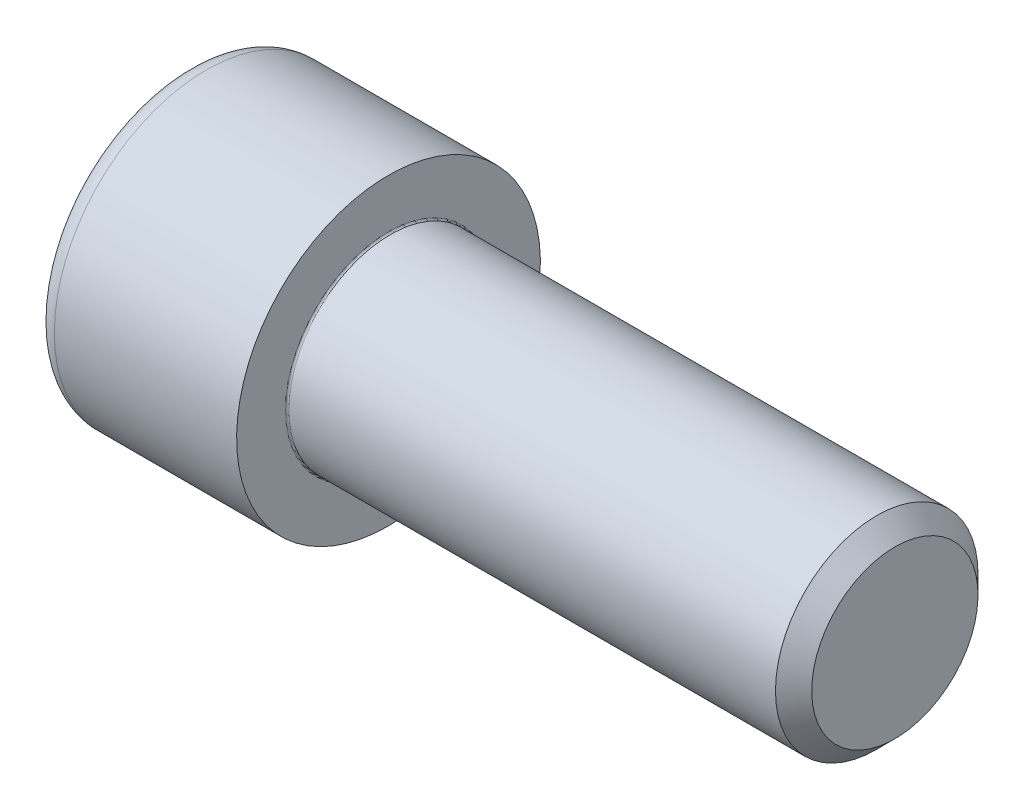
ISO-10303-21;
HEADER;
FILE_DESCRIPTION(('STEP AP214'),'2;1');
FILE_NAME('part.step','',(''),(''),'','','');
FILE_SCHEMA(('AUTOMOTIVE_DESIGN { 1 0 10303 214 1 1 1 1 }'));
ENDSEC;
DATA;
#1=APPLICATION_CONTEXT('core data for automotive mechanical design processes');
#2=APPLICATION_PROTOCOL_DEFINITION('international standard','automotive_design',2000,#1);
#3=PRODUCT_CONTEXT('',#1,'mechanical');
#4=PRODUCT('Part','Part','',(#3));
#5=PRODUCT_RELATED_PRODUCT_CATEGORY('part','',(#4));
#6=PRODUCT_DEFINITION_FORMATION('','',#4);
#7=PRODUCT_DEFINITION_CONTEXT('part definition',#1,'design');
#8=PRODUCT_DEFINITION('design','',#6,#7);
#9=PRODUCT_DEFINITION_SHAPE('','',#8);
#10=(LENGTH_UNIT() NAMED_UNIT(*) SI_UNIT(.MILLI.,.METRE.));
#11=(NAMED_UNIT(*) PLANE_ANGLE_UNIT() SI_UNIT($,.RADIAN.));
#12=(NAMED_UNIT(*) SI_UNIT($,.STERADIAN.) SOLID_ANGLE_UNIT());
#13=UNCERTAINTY_MEASURE_WITH_UNIT(LENGTH_MEASURE(1.E-05),#10,'distance_accuracy_value','');
#14=(GEOMETRIC_REPRESENTATION_CONTEXT(3) GLOBAL_UNCERTAINTY_ASSIGNED_CONTEXT((#13)) GLOBAL_UNIT_ASSIGNED_CONTEXT((#10,
#11,#12)) REPRESENTATION_CONTEXT('',''));
#15=CARTESIAN_POINT('',(0.,0.,0.));
#16=DIRECTION('',(0.,0.,1.));
#17=DIRECTION('',(1.,0.,0.));
#18=AXIS2_PLACEMENT_3D('',#15,#16,#17);
#19=CARTESIAN_POINT('',(-4.33333333333333,0.,0.));
#20=DIRECTION('',(-1.,0.,0.));
#21=DIRECTION('',(0.,1.,0.));
#22=AXIS2_PLACEMENT_3D('',#19,#20,#21);
#23=CONICAL_SURFACE('',#22,2.88675134594813,1.0471975511966);
#24=DIRECTION('',(-0.5,-0.866025403784439,0.));
#25=VECTOR('',#24,1.);
#26=CARTESIAN_POINT('',(-4.33333333333333,-2.88675134594813,0.));
#27=LINE('',#26,#25);
#28=CARTESIAN_POINT('',(-2.66666666666667,0.,0.));
#29=VERTEX_POINT('',#28);
#30=CARTESIAN_POINT('',(-5.5534180126148,-5.,0.));
#31=VERTEX_POINT('',#30);
#32=EDGE_CURVE('E11',#29,#31,#27,.T.);
#33=ORIENTED_EDGE('',*,*,#32,.T.);
#34=CARTESIAN_POINT('',(-5.5534180126148,-5.,0.));
#35=CARTESIAN_POINT('',(-5.5534180126148,-5.,1.33974596215562));
#36=CARTESIAN_POINT('',(-6.,-5.,2.88675134594814));
#37=(BOUNDED_CURVE() B_SPLINE_CURVE(2,(#34,#35,#36),.UNSPECIFIED.,.F.,
.F.) B_SPLINE_CURVE_WITH_KNOTS((3,3),(0.292109034519481,0.584218069038962),
.UNSPECIFIED.) CURVE() GEOMETRIC_REPRESENTATION_ITEM() RATIONAL_B_SPLINE_CURVE((1.07735026918962,
1.07735026918962,1.)) REPRESENTATION_ITEM(''));
#38=CARTESIAN_POINT('',(-6.,-5.,2.88675134594813));
#39=VERTEX_POINT('',#38);
#40=EDGE_CURVE('E148',#31,#39,#37,.T.);
#41=ORIENTED_EDGE('',*,*,#40,.T.);
#42=CARTESIAN_POINT('',(-6.,-5.,2.88675134594812));
#43=CARTESIAN_POINT('',(-5.16666666666666,-2.5,4.3301270189222));
#44=CARTESIAN_POINT('',(-6.,0.,5.77350269189626));
#45=(BOUNDED_CURVE() B_SPLINE_CURVE(2,(#42,#43,#44),.UNSPECIFIED.,.F.,
.F.) B_SPLINE_CURVE_WITH_KNOTS((3,3),(0.,0.584218069038962),
.UNSPECIFIED.) CURVE() GEOMETRIC_REPRESENTATION_ITEM() RATIONAL_B_SPLINE_CURVE((1.,
1.15470053837925,1.)) REPRESENTATION_ITEM(''));
#46=CARTESIAN_POINT('',(-6.,0.,5.77350269189626));
#47=VERTEX_POINT('',#46);
#48=EDGE_CURVE('E28',#39,#47,#45,.T.);
#49=ORIENTED_EDGE('',*,*,#48,.T.);
#50=CARTESIAN_POINT('',(-6.,0.,5.77350269189626));
#51=CARTESIAN_POINT('',(-5.16666666666666,2.5,4.3301270189222));
#52=CARTESIAN_POINT('',(-6.,5.,2.88675134594811));
#53=(BOUNDED_CURVE() B_SPLINE_CURVE(2,(#50,#51,#52),.UNSPECIFIED.,.F.,
.F.) B_SPLINE_CURVE_WITH_KNOTS((3,3),(0.,0.584218069038963),
.UNSPECIFIED.) CURVE() GEOMETRIC_REPRESENTATION_ITEM() RATIONAL_B_SPLINE_CURVE((1.,
1.15470053837925,1.)) REPRESENTATION_ITEM(''));
#54=CARTESIAN_POINT('',(-6.,5.,2.88675134594812));
#55=VERTEX_POINT('',#54);
#56=EDGE_CURVE('E198',#47,#55,#53,.T.);
#57=ORIENTED_EDGE('',*,*,#56,.T.);
#58=CARTESIAN_POINT('',(-6.,5.,2.88675134594814));
#59=CARTESIAN_POINT('',(-5.16666666666666,5.,0.));
#60=CARTESIAN_POINT('',(-6.,5.,-2.88675134594815));
#61=(BOUNDED_CURVE() B_SPLINE_CURVE(2,(#58,#59,#60),.UNSPECIFIED.,.F.,
.F.) B_SPLINE_CURVE_WITH_KNOTS((3,3),(0.,0.584218069038962),
.UNSPECIFIED.) CURVE() GEOMETRIC_REPRESENTATION_ITEM() RATIONAL_B_SPLINE_CURVE((1.,
1.15470053837925,1.)) REPRESENTATION_ITEM(''));
#62=CARTESIAN_POINT('',(-6.,5.,-2.88675134594813));
#63=VERTEX_POINT('',#62);
#64=EDGE_CURVE('E134',#55,#63,#61,.T.);
#65=ORIENTED_EDGE('',*,*,#64,.T.);
#66=CARTESIAN_POINT('',(-6.,5.,-2.88675134594812));
#67=CARTESIAN_POINT('',(-5.16666666666666,2.5,-4.33012701892216));
#68=CARTESIAN_POINT('',(-6.,0.,-5.77350269189626));
#69=(BOUNDED_CURVE() B_SPLINE_CURVE(2,(#66,#67,#68),.UNSPECIFIED.,.F.,
.F.) B_SPLINE_CURVE_WITH_KNOTS((3,3),(0.,0.584218069038962),
.UNSPECIFIED.) CURVE() GEOMETRIC_REPRESENTATION_ITEM() RATIONAL_B_SPLINE_CURVE((1.,
1.15470053837926,1.)) REPRESENTATION_ITEM(''));
#70=CARTESIAN_POINT('',(-6.,0.,-5.77350269189626));
#71=VERTEX_POINT('',#70);
#72=EDGE_CURVE('E162',#63,#71,#69,.T.);
#73=ORIENTED_EDGE('',*,*,#72,.T.);
#74=CARTESIAN_POINT('',(-6.,0.,-5.77350269189626));
#75=CARTESIAN_POINT('',(-5.16666666666666,-2.5,-4.3301270189222));
#76=CARTESIAN_POINT('',(-6.,-5.,-2.88675134594812));
#77=(BOUNDED_CURVE() B_SPLINE_CURVE(2,(#74,#75,#76),.UNSPECIFIED.,.F.,
.F.) B_SPLINE_CURVE_WITH_KNOTS((3,3),(0.,0.584218069038962),
.UNSPECIFIED.) CURVE() GEOMETRIC_REPRESENTATION_ITEM() RATIONAL_B_SPLINE_CURVE((1.,
1.15470053837925,1.)) REPRESENTATION_ITEM(''));
#78=CARTESIAN_POINT('',(-6.,-5.,-2.88675134594813));
#79=VERTEX_POINT('',#78);
#80=EDGE_CURVE('E157',#71,#79,#77,.T.);
#81=ORIENTED_EDGE('',*,*,#80,.T.);
#82=CARTESIAN_POINT('',(-6.,-5.,-2.88675134594814));
#83=CARTESIAN_POINT('',(-5.5534180126148,-5.,-1.33974596215562));
#84=CARTESIAN_POINT('',(-5.5534180126148,-5.,0.));
#85=(BOUNDED_CURVE() B_SPLINE_CURVE(2,(#82,#83,#84),.UNSPECIFIED.,.F.,
.F.) B_SPLINE_CURVE_WITH_KNOTS((3,3),(0.,0.292109034519481),
.UNSPECIFIED.) CURVE() GEOMETRIC_REPRESENTATION_ITEM() RATIONAL_B_SPLINE_CURVE((1.,
1.07735026918962,1.07735026918962)) REPRESENTATION_ITEM(''));
#86=EDGE_CURVE('E141',#79,#31,#85,.T.);
#87=ORIENTED_EDGE('',*,*,#86,.T.);
#88=ORIENTED_EDGE('',*,*,#32,.F.);
#89=EDGE_LOOP('',(#33,#41,#49,#57,#65,#73,#81,#87,#88));
#90=FACE_BOUND('',#89,.T.);
#91=ADVANCED_FACE('F17',(#90),#23,.F.);
#92=CARTESIAN_POINT('',(-12.,-5.,2.88675134594813));
#93=DIRECTION('',(0.,-0.5,0.866025403784439));
#94=DIRECTION('',(-1.,0.,0.));
#95=AXIS2_PLACEMENT_3D('',#92,#93,#94);
#96=PLANE('',#95);
#97=ORIENTED_EDGE('',*,*,#48,.F.);
#98=DIRECTION('',(-1.,0.,0.));
#99=VECTOR('',#98,1.);
#100=CARTESIAN_POINT('',(-6.,-5.,2.88675134594813));
#101=LINE('',#100,#99);
#102=CARTESIAN_POINT('',(-12.,-5.,2.88675134594813));
#103=VERTEX_POINT('',#102);
#104=EDGE_CURVE('E151',#39,#103,#101,.T.);
#105=ORIENTED_EDGE('',*,*,#104,.T.);
#106=DIRECTION('',(0.,-0.866025403784439,-0.5));
#107=VECTOR('',#106,1.);
#108=CARTESIAN_POINT('',(-12.,0.,5.77350269189626));
#109=LINE('',#108,#107);
#110=CARTESIAN_POINT('',(-12.,0.,5.77350269189626));
#111=VERTEX_POINT('',#110);
#112=EDGE_CURVE('E248',#111,#103,#109,.T.);
#113=ORIENTED_EDGE('',*,*,#112,.F.);
#114=DIRECTION('',(1.,0.,0.));
#115=VECTOR('',#114,1.);
#116=CARTESIAN_POINT('',(-12.,0.,5.77350269189626));
#117=LINE('',#116,#115);
#118=EDGE_CURVE('E152',#111,#47,#117,.T.);
#119=ORIENTED_EDGE('',*,*,#118,.T.);
#120=EDGE_LOOP('',(#97,#105,#113,#119));
#121=FACE_BOUND('',#120,.T.);
#122=ADVANCED_FACE('F302',(#121),#96,.F.);
#123=CARTESIAN_POINT('',(-12.,-5.,-2.88675134594813));
#124=DIRECTION('',(0.,-1.,0.));
#125=DIRECTION('',(0.,0.,-1.));
#126=AXIS2_PLACEMENT_3D('',#123,#124,#125);
#127=PLANE('',#126);
#128=ORIENTED_EDGE('',*,*,#86,.F.);
#129=DIRECTION('',(-1.,0.,0.));
#130=VECTOR('',#129,1.);
#131=CARTESIAN_POINT('',(-6.,-5.,-2.88675134594813));
#132=LINE('',#131,#130);
#133=CARTESIAN_POINT('',(-12.,-5.,-2.88675134594813));
#134=VERTEX_POINT('',#133);
#135=EDGE_CURVE('E144',#79,#134,#132,.T.);
#136=ORIENTED_EDGE('',*,*,#135,.T.);
#137=DIRECTION('',(0.,0.,-1.));
#138=VECTOR('',#137,1.);
#139=CARTESIAN_POINT('',(-12.,-5.,2.88675134594813));
#140=LINE('',#139,#138);
#141=EDGE_CURVE('E179',#103,#134,#140,.T.);
#142=ORIENTED_EDGE('',*,*,#141,.F.);
#143=ORIENTED_EDGE('',*,*,#104,.F.);
#144=ORIENTED_EDGE('',*,*,#40,.F.);
#145=EDGE_LOOP('',(#128,#136,#142,#143,#144));
#146=FACE_BOUND('',#145,.T.);
#147=ADVANCED_FACE('F19',(#146),#127,.F.);
#148=CARTESIAN_POINT('',(-12.,0.,5.77350269189626));
#149=DIRECTION('',(0.,0.5,0.866025403784438));
#150=DIRECTION('',(1.,0.,0.));
#151=AXIS2_PLACEMENT_3D('',#148,#149,#150);
#152=PLANE('',#151);
#153=ORIENTED_EDGE('',*,*,#56,.F.);
#154=ORIENTED_EDGE('',*,*,#118,.F.);
#155=DIRECTION('',(0.,-0.866025403784438,0.5));
#156=VECTOR('',#155,1.);
#157=CARTESIAN_POINT('',(-12.,5.,2.88675134594812));
#158=LINE('',#157,#156);
#159=CARTESIAN_POINT('',(-12.,5.,2.88675134594812));
#160=VERTEX_POINT('',#159);
#161=EDGE_CURVE('E213',#160,#111,#158,.T.);
#162=ORIENTED_EDGE('',*,*,#161,.F.);
#163=DIRECTION('',(-1.,0.,0.));
#164=VECTOR('',#163,1.);
#165=CARTESIAN_POINT('',(-6.,5.,2.88675134594812));
#166=LINE('',#165,#164);
#167=EDGE_CURVE('E192',#55,#160,#166,.T.);
#168=ORIENTED_EDGE('',*,*,#167,.F.);
#169=EDGE_LOOP('',(#153,#154,#162,#168));
#170=FACE_BOUND('',#169,.T.);
#171=ADVANCED_FACE('F299',(#170),#152,.F.);
#172=CARTESIAN_POINT('',(-12.,5.,2.88675134594812));
#173=DIRECTION('',(0.,1.,0.));
#174=DIRECTION('',(1.,0.,0.));
#175=AXIS2_PLACEMENT_3D('',#172,#173,#174);
#176=PLANE('',#175);
#177=ORIENTED_EDGE('',*,*,#64,.F.);
#178=ORIENTED_EDGE('',*,*,#167,.T.);
#179=DIRECTION('',(0.,0.,1.));
#180=VECTOR('',#179,1.);
#181=CARTESIAN_POINT('',(-12.,5.,-2.88675134594813));
#182=LINE('',#181,#180);
#183=CARTESIAN_POINT('',(-12.,5.,-2.88675134594813));
#184=VERTEX_POINT('',#183);
#185=EDGE_CURVE('E209',#184,#160,#182,.T.);
#186=ORIENTED_EDGE('',*,*,#185,.F.);
#187=DIRECTION('',(-1.,0.,0.));
#188=VECTOR('',#187,1.);
#189=CARTESIAN_POINT('',(-6.,5.,-2.88675134594813));
#190=LINE('',#189,#188);
#191=EDGE_CURVE('E185',#63,#184,#190,.T.);
#192=ORIENTED_EDGE('',*,*,#191,.F.);
#193=EDGE_LOOP('',(#177,#178,#186,#192));
#194=FACE_BOUND('',#193,.T.);
#195=ADVANCED_FACE('F294',(#194),#176,.F.);
#196=CARTESIAN_POINT('',(-12.,5.,-2.88675134594813));
#197=DIRECTION('',(0.,0.5,-0.866025403784439));
#198=DIRECTION('',(-1.,0.,0.));
#199=AXIS2_PLACEMENT_3D('',#196,#197,#198);
#200=PLANE('',#199);
#201=ORIENTED_EDGE('',*,*,#72,.F.);
#202=ORIENTED_EDGE('',*,*,#191,.T.);
#203=DIRECTION('',(0.,0.866025403784439,0.5));
#204=VECTOR('',#203,1.);
#205=CARTESIAN_POINT('',(-12.,0.,-5.77350269189626));
#206=LINE('',#205,#204);
#207=CARTESIAN_POINT('',(-12.,0.,-5.77350269189626));
#208=VERTEX_POINT('',#207);
#209=EDGE_CURVE('E175',#208,#184,#206,.T.);
#210=ORIENTED_EDGE('',*,*,#209,.F.);
#211=DIRECTION('',(-1.,0.,0.));
#212=VECTOR('',#211,1.);
#213=CARTESIAN_POINT('',(-6.,0.,-5.77350269189626));
#214=LINE('',#213,#212);
#215=EDGE_CURVE('E163',#71,#208,#214,.T.);
#216=ORIENTED_EDGE('',*,*,#215,.F.);
#217=EDGE_LOOP('',(#201,#202,#210,#216));
#218=FACE_BOUND('',#217,.T.);
#219=ADVANCED_FACE('F354',(#218),#200,.F.);
#220=CARTESIAN_POINT('',(-12.,0.,-5.77350269189626));
#221=DIRECTION('',(0.,-0.5,-0.866025403784439));
#222=DIRECTION('',(0.,-0.866025403784439,0.5));
#223=AXIS2_PLACEMENT_3D('',#220,#221,#222);
#224=PLANE('',#223);
#225=ORIENTED_EDGE('',*,*,#80,.F.);
#226=ORIENTED_EDGE('',*,*,#215,.T.);
#227=DIRECTION('',(0.,0.866025403784439,-0.5));
#228=VECTOR('',#227,1.);
#229=CARTESIAN_POINT('',(-12.,-5.,-2.88675134594813));
#230=LINE('',#229,#228);
#231=EDGE_CURVE('E159',#134,#208,#230,.T.);
#232=ORIENTED_EDGE('',*,*,#231,.F.);
#233=ORIENTED_EDGE('',*,*,#135,.F.);
#234=EDGE_LOOP('',(#225,#226,#232,#233));
#235=FACE_BOUND('',#234,.T.);
#236=ADVANCED_FACE('F156',(#235),#224,.F.);
#237=CARTESIAN_POINT('',(-6.,0.,0.));
#238=DIRECTION('',(1.,0.,0.));
#239=DIRECTION('',(0.,1.,0.));
#240=AXIS2_PLACEMENT_3D('',#237,#238,#239);
#241=CYLINDRICAL_SURFACE('',#240,9.);
#242=CARTESIAN_POINT('',(0.,0.,0.));
#243=DIRECTION('',(1.,0.,0.));
#244=DIRECTION('',(0.,1.,0.));
#245=AXIS2_PLACEMENT_3D('',#242,#243,#244);
#246=CIRCLE('',#245,9.);
#247=CARTESIAN_POINT('',(0.,-9.,0.));
#248=VERTEX_POINT('',#247);
#249=EDGE_CURVE('E282',#248,#248,#246,.T.);
#250=ORIENTED_EDGE('',*,*,#249,.F.);
#251=DIRECTION('',(-1.,0.,0.));
#252=VECTOR('',#251,1.);
#253=CARTESIAN_POINT('',(-6.,-9.,0.));
#254=LINE('',#253,#252);
#255=CARTESIAN_POINT('',(-10.8,-9.,0.));
#256=VERTEX_POINT('',#255);
#257=EDGE_CURVE('E72',#248,#256,#254,.T.);
#258=ORIENTED_EDGE('',*,*,#257,.T.);
#259=CARTESIAN_POINT('',(-10.8,0.,0.));
#260=DIRECTION('',(-1.,0.,0.));
#261=DIRECTION('',(0.,-1.,0.));
#262=AXIS2_PLACEMENT_3D('',#259,#260,#261);
#263=CIRCLE('',#262,9.);
#264=CARTESIAN_POINT('',(-10.8,0.,9.));
#265=VERTEX_POINT('',#264);
#266=EDGE_CURVE('E219',#265,#256,#263,.T.);
#267=ORIENTED_EDGE('',*,*,#266,.F.);
#268=CARTESIAN_POINT('',(-10.8,0.,0.));
#269=DIRECTION('',(-1.,0.,0.));
#270=DIRECTION('',(0.,-1.,0.));
#271=AXIS2_PLACEMENT_3D('',#268,#269,#270);
#272=CIRCLE('',#271,9.);
#273=EDGE_CURVE('E217',#256,#265,#272,.T.);
#274=ORIENTED_EDGE('',*,*,#273,.F.);
#275=ORIENTED_EDGE('',*,*,#257,.F.);
#276=EDGE_LOOP('',(#250,#258,#267,#274,#275));
#277=FACE_BOUND('',#276,.T.);
#278=ADVANCED_FACE('F353',(#277),#241,.T.);
#279=CARTESIAN_POINT('',(-12.,7.38675134594813,0.));
#280=DIRECTION('',(-1.,0.,0.));
#281=DIRECTION('',(0.,0.,1.));
#282=AXIS2_PLACEMENT_3D('',#279,#280,#281);
#283=PLANE('',#282);
#284=ORIENTED_EDGE('',*,*,#185,.T.);
#285=ORIENTED_EDGE('',*,*,#161,.T.);
#286=ORIENTED_EDGE('',*,*,#112,.T.);
#287=ORIENTED_EDGE('',*,*,#141,.T.);
#288=ORIENTED_EDGE('',*,*,#231,.T.);
#289=ORIENTED_EDGE('',*,*,#209,.T.);
#290=EDGE_LOOP('',(#284,#285,#286,#287,#288,#289));
#291=FACE_BOUND('',#290,.T.);
#292=CARTESIAN_POINT('',(-12.,0.,0.));
#293=DIRECTION('',(1.,0.,0.));
#294=DIRECTION('',(0.,-1.,0.));
#295=AXIS2_PLACEMENT_3D('',#292,#293,#294);
#296=CIRCLE('',#295,7.8);
#297=CARTESIAN_POINT('',(-12.,0.,7.8));
#298=VERTEX_POINT('',#297);
#299=EDGE_CURVE('E214',#298,#298,#296,.T.);
#300=ORIENTED_EDGE('',*,*,#299,.F.);
#301=EDGE_LOOP('',(#300));
#302=FACE_BOUND('',#301,.T.);
#303=ADVANCED_FACE('F290',(#291,#302),#283,.T.);
#304=CARTESIAN_POINT('',(-10.8,0.,0.));
#305=DIRECTION('',(1.,0.,0.));
#306=DIRECTION('',(0.,0.,-1.));
#307=AXIS2_PLACEMENT_3D('',#304,#305,#306);
#308=TOROIDAL_SURFACE('',#307,7.8,1.2);
#309=ORIENTED_EDGE('',*,*,#266,.T.);
#310=ORIENTED_EDGE('',*,*,#273,.T.);
#311=CARTESIAN_POINT('',(-10.8,0.,7.8));
#312=DIRECTION('',(0.,-1.,0.));
#313=DIRECTION('',(0.,0.,1.));
#314=AXIS2_PLACEMENT_3D('',#311,#312,#313);
#315=CIRCLE('',#314,1.2);
#316=EDGE_CURVE('E21',#265,#298,#315,.T.);
#317=ORIENTED_EDGE('',*,*,#316,.T.);
#318=ORIENTED_EDGE('',*,*,#299,.T.);
#319=ORIENTED_EDGE('',*,*,#316,.F.);
#320=EDGE_LOOP('',(#309,#310,#317,#318,#319));
#321=FACE_BOUND('',#320,.T.);
#322=ADVANCED_FACE('F427',(#321),#308,.T.);
#323=CARTESIAN_POINT('',(30.,3.,0.));
#324=DIRECTION('',(1.,0.,0.));
#325=DIRECTION('',(0.,1.,0.));
#326=AXIS2_PLACEMENT_3D('',#323,#324,#325);
#327=PLANE('',#326);
#328=CARTESIAN_POINT('',(30.,0.,0.));
#329=DIRECTION('',(-1.,0.,0.));
#330=DIRECTION('',(0.,-1.,0.));
#331=AXIS2_PLACEMENT_3D('',#328,#329,#330);
#332=CIRCLE('',#331,4.9264625);
#333=CARTESIAN_POINT('',(30.,4.9264625,0.));
#334=VERTEX_POINT('',#333);
#335=EDGE_CURVE('E224',#334,#334,#332,.T.);
#336=ORIENTED_EDGE('',*,*,#335,.F.);
#337=EDGE_LOOP('',(#336));
#338=FACE_BOUND('',#337,.T.);
#339=ADVANCED_FACE('F419',(#338),#327,.T.);
#340=CARTESIAN_POINT('',(29.46323125,0.,0.));
#341=DIRECTION('',(-1.,0.,0.));
#342=DIRECTION('',(0.,-1.,0.));
#343=AXIS2_PLACEMENT_3D('',#340,#341,#342);
#344=CONICAL_SURFACE('',#343,5.46323125,0.785398163397447);
#345=CARTESIAN_POINT('',(28.9264625,0.,0.));
#346=DIRECTION('',(1.,0.,0.));
#347=DIRECTION('',(0.,-1.,0.));
#348=AXIS2_PLACEMENT_3D('',#345,#346,#347);
#349=CIRCLE('',#348,6.);
#350=CARTESIAN_POINT('',(28.9264625,6.,0.));
#351=VERTEX_POINT('',#350);
#352=CARTESIAN_POINT('',(28.9264625,-6.,0.));
#353=VERTEX_POINT('',#352);
#354=EDGE_CURVE('E264',#351,#353,#349,.T.);
#355=ORIENTED_EDGE('',*,*,#354,.T.);
#356=CARTESIAN_POINT('',(28.9264625,0.,0.));
#357=DIRECTION('',(1.,0.,0.));
#358=DIRECTION('',(0.,-1.,0.));
#359=AXIS2_PLACEMENT_3D('',#356,#357,#358);
#360=CIRCLE('',#359,6.);
#361=EDGE_CURVE('E259',#353,#351,#360,.T.);
#362=ORIENTED_EDGE('',*,*,#361,.T.);
#363=DIRECTION('',(0.707106781186548,-0.707106781186547,0.));
#364=VECTOR('',#363,1.);
#365=CARTESIAN_POINT('',(29.46323125,5.46323125,0.));
#366=LINE('',#365,#364);
#367=EDGE_CURVE('E229',#351,#334,#366,.T.);
#368=ORIENTED_EDGE('',*,*,#367,.T.);
#369=ORIENTED_EDGE('',*,*,#335,.T.);
#370=ORIENTED_EDGE('',*,*,#367,.F.);
#371=EDGE_LOOP('',(#355,#362,#368,#369,#370));
#372=FACE_BOUND('',#371,.T.);
#373=ADVANCED_FACE('F390',(#372),#344,.T.);
#374=CARTESIAN_POINT('',(0.,7.5,0.));
#375=DIRECTION('',(1.,0.,0.));
#376=DIRECTION('',(0.,1.,0.));
#377=AXIS2_PLACEMENT_3D('',#374,#375,#376);
#378=PLANE('',#377);
#379=CARTESIAN_POINT('',(0.,0.,0.));
#380=DIRECTION('',(1.,0.,0.));
#381=DIRECTION('',(0.,-1.,0.));
#382=AXIS2_PLACEMENT_3D('',#379,#380,#381);
#383=CIRCLE('',#382,6.1);
#384=CARTESIAN_POINT('',(0.,0.,6.1));
#385=VERTEX_POINT('',#384);
#386=EDGE_CURVE('E253',#385,#385,#383,.T.);
#387=ORIENTED_EDGE('',*,*,#386,.F.);
#388=EDGE_LOOP('',(#387));
#389=FACE_BOUND('',#388,.T.);
#390=ORIENTED_EDGE('',*,*,#249,.T.);
#391=EDGE_LOOP('',(#390));
#392=FACE_BOUND('',#391,.T.);
#393=ADVANCED_FACE('F378',(#389,#392),#378,.T.);
#394=CARTESIAN_POINT('',(17.1875,0.,0.));
#395=DIRECTION('',(1.,0.,0.));
#396=DIRECTION('',(0.,1.,0.));
#397=AXIS2_PLACEMENT_3D('',#394,#395,#396);
#398=CYLINDRICAL_SURFACE('',#397,6.);
#399=ORIENTED_EDGE('',*,*,#354,.F.);
#400=ORIENTED_EDGE('',*,*,#361,.F.);
#401=DIRECTION('',(-1.,0.,0.));
#402=VECTOR('',#401,1.);
#403=CARTESIAN_POINT('',(17.1875,-6.,0.));
#404=LINE('',#403,#402);
#405=CARTESIAN_POINT('',(0.1,-6.,0.));
#406=VERTEX_POINT('',#405);
#407=EDGE_CURVE('E263',#353,#406,#404,.T.);
#408=ORIENTED_EDGE('',*,*,#407,.T.);
#409=CARTESIAN_POINT('',(0.100000000000002,0.,0.));
#410=DIRECTION('',(-1.,0.,0.));
#411=DIRECTION('',(0.,-1.,0.));
#412=AXIS2_PLACEMENT_3D('',#409,#410,#411);
#413=CIRCLE('',#412,6.);
#414=CARTESIAN_POINT('',(0.100000000000002,0.,6.));
#415=VERTEX_POINT('',#414);
#416=EDGE_CURVE('E258',#415,#406,#413,.T.);
#417=ORIENTED_EDGE('',*,*,#416,.F.);
#418=CARTESIAN_POINT('',(0.100000000000002,0.,0.));
#419=DIRECTION('',(-1.,0.,0.));
#420=DIRECTION('',(0.,-1.,0.));
#421=AXIS2_PLACEMENT_3D('',#418,#419,#420);
#422=CIRCLE('',#421,6.);
#423=EDGE_CURVE('E254',#406,#415,#422,.T.);
#424=ORIENTED_EDGE('',*,*,#423,.F.);
#425=ORIENTED_EDGE('',*,*,#407,.F.);
#426=EDGE_LOOP('',(#399,#400,#408,#417,#424,#425));
#427=FACE_BOUND('',#426,.T.);
#428=ADVANCED_FACE('F372',(#427),#398,.T.);
#429=CARTESIAN_POINT('',(0.100000000000002,0.,0.));
#430=DIRECTION('',(1.,0.,0.));
#431=DIRECTION('',(0.,0.,-1.));
#432=AXIS2_PLACEMENT_3D('',#429,#430,#431);
#433=TOROIDAL_SURFACE('',#432,6.1,0.1);
#434=ORIENTED_EDGE('',*,*,#416,.T.);
#435=ORIENTED_EDGE('',*,*,#423,.T.);
#436=CARTESIAN_POINT('',(0.100000000000002,0.,6.1));
#437=DIRECTION('',(0.,1.,0.));
#438=DIRECTION('',(0.,0.,1.));
#439=AXIS2_PLACEMENT_3D('',#436,#437,#438);
#440=CIRCLE('',#439,0.1);
#441=EDGE_CURVE('E249',#415,#385,#440,.T.);
#442=ORIENTED_EDGE('',*,*,#441,.T.);
#443=ORIENTED_EDGE('',*,*,#386,.T.);
#444=ORIENTED_EDGE('',*,*,#441,.F.);
#445=EDGE_LOOP('',(#434,#435,#442,#443,#444));
#446=FACE_BOUND('',#445,.T.);
#447=ADVANCED_FACE('F377',(#446),#433,.F.);
#448=CLOSED_SHELL('',(#91,#122,#147,#171,#195,#219,#236,#278,#303,#322,#339,#373,#393,#428,#447));
#449=MANIFOLD_SOLID_BREP('B1',#448);
#450=ADVANCED_BREP_SHAPE_REPRESENTATION('',(#18,#449),#14);
#451=SHAPE_DEFINITION_REPRESENTATION(#9,#450);
ENDSEC;
END-ISO-10303-21;
